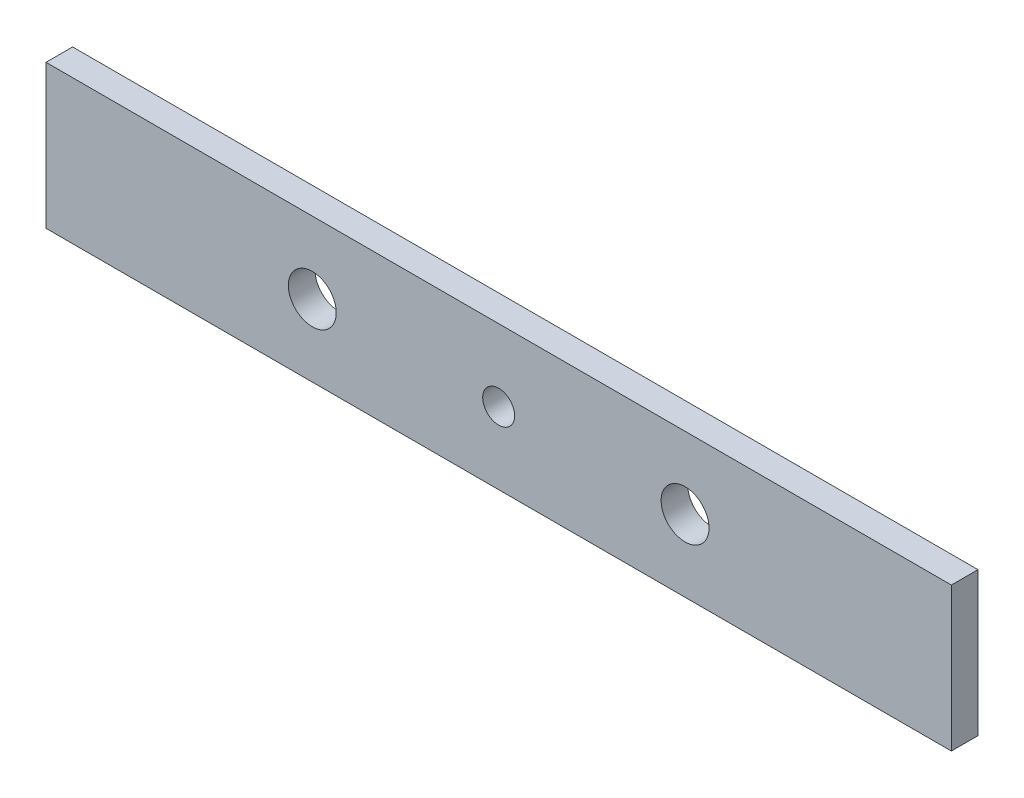
ISO-10303-21;
HEADER;
FILE_DESCRIPTION(('STEP AP214'),'2;1');
FILE_NAME('part.step','',(''),(''),'','','');
FILE_SCHEMA(('AUTOMOTIVE_DESIGN { 1 0 10303 214 1 1 1 1 }'));
ENDSEC;
DATA;
#1=APPLICATION_CONTEXT('core data for automotive mechanical design processes');
#2=APPLICATION_PROTOCOL_DEFINITION('international standard','automotive_design',2000,#1);
#3=PRODUCT_CONTEXT('',#1,'mechanical');
#4=PRODUCT('Part','Part','',(#3));
#5=PRODUCT_RELATED_PRODUCT_CATEGORY('part','',(#4));
#6=PRODUCT_DEFINITION_FORMATION('','',#4);
#7=PRODUCT_DEFINITION_CONTEXT('part definition',#1,'design');
#8=PRODUCT_DEFINITION('design','',#6,#7);
#9=PRODUCT_DEFINITION_SHAPE('','',#8);
#10=(LENGTH_UNIT() NAMED_UNIT(*) SI_UNIT(.MILLI.,.METRE.));
#11=(NAMED_UNIT(*) PLANE_ANGLE_UNIT() SI_UNIT($,.RADIAN.));
#12=(NAMED_UNIT(*) SI_UNIT($,.STERADIAN.) SOLID_ANGLE_UNIT());
#13=UNCERTAINTY_MEASURE_WITH_UNIT(LENGTH_MEASURE(1.E-05),#10,'distance_accuracy_value','');
#14=(GEOMETRIC_REPRESENTATION_CONTEXT(3) GLOBAL_UNCERTAINTY_ASSIGNED_CONTEXT((#13)) GLOBAL_UNIT_ASSIGNED_CONTEXT((#10,
#11,#12)) REPRESENTATION_CONTEXT('',''));
#15=CARTESIAN_POINT('',(0.,0.,0.));
#16=DIRECTION('',(0.,0.,1.));
#17=DIRECTION('',(1.,0.,0.));
#18=AXIS2_PLACEMENT_3D('',#15,#16,#17);
#19=CARTESIAN_POINT('',(0.,27.,0.));
#20=DIRECTION('',(1.,0.,0.));
#21=DIRECTION('',(0.,0.,-1.));
#22=AXIS2_PLACEMENT_3D('',#19,#20,#21);
#23=PLANE('',#22);
#24=DIRECTION('',(0.,0.,1.));
#25=VECTOR('',#24,1.);
#26=CARTESIAN_POINT('',(0.,0.,0.));
#27=LINE('',#26,#25);
#28=CARTESIAN_POINT('',(0.,0.,-5.));
#29=VERTEX_POINT('',#28);
#30=CARTESIAN_POINT('',(0.,0.,0.));
#31=VERTEX_POINT('',#30);
#32=EDGE_CURVE('E99',#29,#31,#27,.T.);
#33=ORIENTED_EDGE('',*,*,#32,.T.);
#34=DIRECTION('',(0.,-1.,0.));
#35=VECTOR('',#34,1.);
#36=CARTESIAN_POINT('',(0.,27.,0.));
#37=LINE('',#36,#35);
#38=CARTESIAN_POINT('',(0.,27.,0.));
#39=VERTEX_POINT('',#38);
#40=EDGE_CURVE('E11',#39,#31,#37,.T.);
#41=ORIENTED_EDGE('',*,*,#40,.F.);
#42=DIRECTION('',(0.,0.,1.));
#43=VECTOR('',#42,1.);
#44=CARTESIAN_POINT('',(0.,27.,0.));
#45=LINE('',#44,#43);
#46=CARTESIAN_POINT('',(0.,27.,-5.));
#47=VERTEX_POINT('',#46);
#48=EDGE_CURVE('E86',#47,#39,#45,.T.);
#49=ORIENTED_EDGE('',*,*,#48,.F.);
#50=DIRECTION('',(0.,-1.,0.));
#51=VECTOR('',#50,1.);
#52=CARTESIAN_POINT('',(0.,27.,-5.));
#53=LINE('',#52,#51);
#54=EDGE_CURVE('E95',#47,#29,#53,.T.);
#55=ORIENTED_EDGE('',*,*,#54,.T.);
#56=EDGE_LOOP('',(#33,#41,#49,#55));
#57=FACE_BOUND('',#56,.T.);
#58=ADVANCED_FACE('F33',(#57),#23,.F.);
#59=CARTESIAN_POINT('',(0.,27.,0.));
#60=DIRECTION('',(0.,0.,-1.));
#61=DIRECTION('',(-1.,0.,0.));
#62=AXIS2_PLACEMENT_3D('',#59,#60,#61);
#63=PLANE('',#62);
#64=CARTESIAN_POINT('',(120.,13.5,0.));
#65=DIRECTION('',(0.,0.,1.));
#66=DIRECTION('',(1.,0.,0.));
#67=AXIS2_PLACEMENT_3D('',#64,#65,#66);
#68=CIRCLE('',#67,4.49999999999999);
#69=CARTESIAN_POINT('',(124.5,13.5,0.));
#70=VERTEX_POINT('',#69);
#71=EDGE_CURVE('E210',#70,#70,#68,.T.);
#72=ORIENTED_EDGE('',*,*,#71,.F.);
#73=EDGE_LOOP('',(#72));
#74=FACE_BOUND('',#73,.T.);
#75=CARTESIAN_POINT('',(50.,13.5,0.));
#76=DIRECTION('',(0.,0.,1.));
#77=DIRECTION('',(1.,0.,0.));
#78=AXIS2_PLACEMENT_3D('',#75,#76,#77);
#79=CIRCLE('',#78,4.5);
#80=CARTESIAN_POINT('',(54.5,13.5,0.));
#81=VERTEX_POINT('',#80);
#82=EDGE_CURVE('E207',#81,#81,#79,.T.);
#83=ORIENTED_EDGE('',*,*,#82,.F.);
#84=EDGE_LOOP('',(#83));
#85=FACE_BOUND('',#84,.T.);
#86=CARTESIAN_POINT('',(85.,13.5,0.));
#87=DIRECTION('',(0.,0.,1.));
#88=DIRECTION('',(1.,0.,0.));
#89=AXIS2_PLACEMENT_3D('',#86,#87,#88);
#90=CIRCLE('',#89,3.00000000000001);
#91=CARTESIAN_POINT('',(88.,13.5,0.));
#92=VERTEX_POINT('',#91);
#93=EDGE_CURVE('E110',#92,#92,#90,.T.);
#94=ORIENTED_EDGE('',*,*,#93,.F.);
#95=EDGE_LOOP('',(#94));
#96=FACE_BOUND('',#95,.T.);
#97=DIRECTION('',(1.,0.,0.));
#98=VECTOR('',#97,1.);
#99=CARTESIAN_POINT('',(0.,0.,0.));
#100=LINE('',#99,#98);
#101=CARTESIAN_POINT('',(170.,0.,0.));
#102=VERTEX_POINT('',#101);
#103=EDGE_CURVE('E90',#31,#102,#100,.T.);
#104=ORIENTED_EDGE('',*,*,#103,.T.);
#105=DIRECTION('',(0.,-1.,0.));
#106=VECTOR('',#105,1.);
#107=CARTESIAN_POINT('',(170.,27.,0.));
#108=LINE('',#107,#106);
#109=CARTESIAN_POINT('',(170.,27.,0.));
#110=VERTEX_POINT('',#109);
#111=EDGE_CURVE('E42',#110,#102,#108,.T.);
#112=ORIENTED_EDGE('',*,*,#111,.F.);
#113=DIRECTION('',(1.,0.,0.));
#114=VECTOR('',#113,1.);
#115=CARTESIAN_POINT('',(0.,27.,0.));
#116=LINE('',#115,#114);
#117=EDGE_CURVE('E81',#39,#110,#116,.T.);
#118=ORIENTED_EDGE('',*,*,#117,.F.);
#119=ORIENTED_EDGE('',*,*,#40,.T.);
#120=EDGE_LOOP('',(#104,#112,#118,#119));
#121=FACE_BOUND('',#120,.T.);
#122=ADVANCED_FACE('F89',(#74,#85,#96,#121),#63,.F.);
#123=CARTESIAN_POINT('',(170.,27.,0.));
#124=DIRECTION('',(-1.,0.,0.));
#125=DIRECTION('',(0.,0.,1.));
#126=AXIS2_PLACEMENT_3D('',#123,#124,#125);
#127=PLANE('',#126);
#128=DIRECTION('',(0.,0.,-1.));
#129=VECTOR('',#128,1.);
#130=CARTESIAN_POINT('',(170.,0.,0.));
#131=LINE('',#130,#129);
#132=CARTESIAN_POINT('',(170.,0.,-5.));
#133=VERTEX_POINT('',#132);
#134=EDGE_CURVE('E68',#102,#133,#131,.T.);
#135=ORIENTED_EDGE('',*,*,#134,.T.);
#136=DIRECTION('',(0.,-1.,0.));
#137=VECTOR('',#136,1.);
#138=CARTESIAN_POINT('',(170.,27.,-5.));
#139=LINE('',#138,#137);
#140=CARTESIAN_POINT('',(170.,27.,-5.));
#141=VERTEX_POINT('',#140);
#142=EDGE_CURVE('E91',#141,#133,#139,.T.);
#143=ORIENTED_EDGE('',*,*,#142,.F.);
#144=DIRECTION('',(0.,0.,-1.));
#145=VECTOR('',#144,1.);
#146=CARTESIAN_POINT('',(170.,27.,0.));
#147=LINE('',#146,#145);
#148=EDGE_CURVE('E84',#110,#141,#147,.T.);
#149=ORIENTED_EDGE('',*,*,#148,.F.);
#150=ORIENTED_EDGE('',*,*,#111,.T.);
#151=EDGE_LOOP('',(#135,#143,#149,#150));
#152=FACE_BOUND('',#151,.T.);
#153=ADVANCED_FACE('F93',(#152),#127,.F.);
#154=CARTESIAN_POINT('',(0.,27.,-5.));
#155=DIRECTION('',(0.,0.,1.));
#156=DIRECTION('',(1.,0.,0.));
#157=AXIS2_PLACEMENT_3D('',#154,#155,#156);
#158=PLANE('',#157);
#159=CARTESIAN_POINT('',(120.,13.5,-5.));
#160=DIRECTION('',(0.,0.,1.));
#161=DIRECTION('',(1.,0.,0.));
#162=AXIS2_PLACEMENT_3D('',#159,#160,#161);
#163=CIRCLE('',#162,4.49999999999999);
#164=CARTESIAN_POINT('',(124.5,13.5,-5.));
#165=VERTEX_POINT('',#164);
#166=EDGE_CURVE('E36',#165,#165,#163,.T.);
#167=ORIENTED_EDGE('',*,*,#166,.T.);
#168=EDGE_LOOP('',(#167));
#169=FACE_BOUND('',#168,.T.);
#170=CARTESIAN_POINT('',(50.,13.5,-5.));
#171=DIRECTION('',(0.,0.,1.));
#172=DIRECTION('',(1.,0.,0.));
#173=AXIS2_PLACEMENT_3D('',#170,#171,#172);
#174=CIRCLE('',#173,4.5);
#175=CARTESIAN_POINT('',(54.5,13.5,-5.));
#176=VERTEX_POINT('',#175);
#177=EDGE_CURVE('E109',#176,#176,#174,.T.);
#178=ORIENTED_EDGE('',*,*,#177,.T.);
#179=EDGE_LOOP('',(#178));
#180=FACE_BOUND('',#179,.T.);
#181=CARTESIAN_POINT('',(85.,13.5,-5.));
#182=DIRECTION('',(0.,0.,1.));
#183=DIRECTION('',(1.,0.,0.));
#184=AXIS2_PLACEMENT_3D('',#181,#182,#183);
#185=CIRCLE('',#184,3.00000000000001);
#186=CARTESIAN_POINT('',(88.,13.5,-5.));
#187=VERTEX_POINT('',#186);
#188=EDGE_CURVE('E107',#187,#187,#185,.T.);
#189=ORIENTED_EDGE('',*,*,#188,.T.);
#190=EDGE_LOOP('',(#189));
#191=FACE_BOUND('',#190,.T.);
#192=DIRECTION('',(-1.,0.,0.));
#193=VECTOR('',#192,1.);
#194=CARTESIAN_POINT('',(0.,0.,-5.));
#195=LINE('',#194,#193);
#196=EDGE_CURVE('E74',#133,#29,#195,.T.);
#197=ORIENTED_EDGE('',*,*,#196,.T.);
#198=ORIENTED_EDGE('',*,*,#54,.F.);
#199=DIRECTION('',(-1.,0.,0.));
#200=VECTOR('',#199,1.);
#201=CARTESIAN_POINT('',(0.,27.,-5.));
#202=LINE('',#201,#200);
#203=EDGE_CURVE('E51',#141,#47,#202,.T.);
#204=ORIENTED_EDGE('',*,*,#203,.F.);
#205=ORIENTED_EDGE('',*,*,#142,.T.);
#206=EDGE_LOOP('',(#197,#198,#204,#205));
#207=FACE_BOUND('',#206,.T.);
#208=ADVANCED_FACE('F117',(#169,#180,#191,#207),#158,.F.);
#209=CARTESIAN_POINT('',(0.,27.,0.));
#210=DIRECTION('',(0.,-1.,0.));
#211=DIRECTION('',(0.,0.,-1.));
#212=AXIS2_PLACEMENT_3D('',#209,#210,#211);
#213=PLANE('',#212);
#214=ORIENTED_EDGE('',*,*,#48,.T.);
#215=ORIENTED_EDGE('',*,*,#117,.T.);
#216=ORIENTED_EDGE('',*,*,#148,.T.);
#217=ORIENTED_EDGE('',*,*,#203,.T.);
#218=EDGE_LOOP('',(#214,#215,#216,#217));
#219=FACE_BOUND('',#218,.T.);
#220=ADVANCED_FACE('F82',(#219),#213,.F.);
#221=CARTESIAN_POINT('',(0.,0.,0.));
#222=DIRECTION('',(0.,-1.,0.));
#223=DIRECTION('',(0.,0.,-1.));
#224=AXIS2_PLACEMENT_3D('',#221,#222,#223);
#225=PLANE('',#224);
#226=ORIENTED_EDGE('',*,*,#32,.F.);
#227=ORIENTED_EDGE('',*,*,#196,.F.);
#228=ORIENTED_EDGE('',*,*,#134,.F.);
#229=ORIENTED_EDGE('',*,*,#103,.F.);
#230=EDGE_LOOP('',(#226,#227,#228,#229));
#231=FACE_BOUND('',#230,.T.);
#232=ADVANCED_FACE('F140',(#231),#225,.T.);
#233=CARTESIAN_POINT('',(85.,13.5,-29.));
#234=DIRECTION('',(0.,0.,1.));
#235=DIRECTION('',(1.,0.,0.));
#236=AXIS2_PLACEMENT_3D('',#233,#234,#235);
#237=CYLINDRICAL_SURFACE('',#236,3.00000000000001);
#238=CARTESIAN_POINT('',(88.,13.5,0.));
#239=CARTESIAN_POINT('',(88.,13.5,-0.0520833333333334));
#240=CARTESIAN_POINT('',(88.,13.5,-0.104166666666667));
#241=CARTESIAN_POINT('',(88.,13.5,-0.208333333333334));
#242=CARTESIAN_POINT('',(88.,13.5,-0.260416666666667));
#243=CARTESIAN_POINT('',(88.,13.5,-0.364583333333334));
#244=CARTESIAN_POINT('',(88.,13.5,-0.416666666666667));
#245=CARTESIAN_POINT('',(88.,13.5,-0.520833333333334));
#246=CARTESIAN_POINT('',(88.,13.5,-0.572916666666667));
#247=CARTESIAN_POINT('',(88.,13.5,-0.677083333333334));
#248=CARTESIAN_POINT('',(88.,13.5,-0.729166666666667));
#249=CARTESIAN_POINT('',(88.,13.5,-0.833333333333334));
#250=CARTESIAN_POINT('',(88.,13.5,-0.885416666666668));
#251=CARTESIAN_POINT('',(88.,13.5,-0.989583333333334));
#252=CARTESIAN_POINT('',(88.,13.5,-1.04166666666667));
#253=CARTESIAN_POINT('',(88.,13.5,-1.14583333333333));
#254=CARTESIAN_POINT('',(88.,13.5,-1.19791666666667));
#255=CARTESIAN_POINT('',(88.,13.5,-1.30208333333333));
#256=CARTESIAN_POINT('',(88.,13.5,-1.35416666666667));
#257=CARTESIAN_POINT('',(88.,13.5,-1.45833333333333));
#258=CARTESIAN_POINT('',(88.,13.5,-1.51041666666667));
#259=CARTESIAN_POINT('',(88.,13.5,-1.61458333333333));
#260=CARTESIAN_POINT('',(88.,13.5,-1.66666666666667));
#261=CARTESIAN_POINT('',(88.,13.5,-1.77083333333334));
#262=CARTESIAN_POINT('',(88.,13.5,-1.82291666666667));
#263=CARTESIAN_POINT('',(88.,13.5,-1.92708333333334));
#264=CARTESIAN_POINT('',(88.,13.5,-1.97916666666667));
#265=CARTESIAN_POINT('',(88.,13.5,-2.08333333333334));
#266=CARTESIAN_POINT('',(88.,13.5,-2.13541666666667));
#267=CARTESIAN_POINT('',(88.,13.5,-2.23958333333334));
#268=CARTESIAN_POINT('',(88.,13.5,-2.29166666666667));
#269=CARTESIAN_POINT('',(88.,13.5,-2.39583333333334));
#270=CARTESIAN_POINT('',(88.,13.5,-2.44791666666667));
#271=CARTESIAN_POINT('',(88.,13.5,-2.55208333333334));
#272=CARTESIAN_POINT('',(88.,13.5,-2.60416666666667));
#273=CARTESIAN_POINT('',(88.,13.5,-2.70833333333334));
#274=CARTESIAN_POINT('',(88.,13.5,-2.76041666666667));
#275=CARTESIAN_POINT('',(88.,13.5,-2.86458333333334));
#276=CARTESIAN_POINT('',(88.,13.5,-2.91666666666667));
#277=CARTESIAN_POINT('',(88.,13.5,-3.02083333333334));
#278=CARTESIAN_POINT('',(88.,13.5,-3.07291666666667));
#279=CARTESIAN_POINT('',(88.,13.5,-3.17708333333334));
#280=CARTESIAN_POINT('',(88.,13.5,-3.22916666666667));
#281=CARTESIAN_POINT('',(88.,13.5,-3.33333333333334));
#282=CARTESIAN_POINT('',(88.,13.5,-3.38541666666667));
#283=CARTESIAN_POINT('',(88.,13.5,-3.48958333333334));
#284=CARTESIAN_POINT('',(88.,13.5,-3.54166666666667));
#285=CARTESIAN_POINT('',(88.,13.5,-3.64583333333334));
#286=CARTESIAN_POINT('',(88.,13.5,-3.69791666666667));
#287=CARTESIAN_POINT('',(88.,13.5,-3.80208333333334));
#288=CARTESIAN_POINT('',(88.,13.5,-3.85416666666667));
#289=CARTESIAN_POINT('',(88.,13.5,-3.95833333333334));
#290=CARTESIAN_POINT('',(88.,13.5,-4.01041666666667));
#291=CARTESIAN_POINT('',(88.,13.5,-4.11458333333334));
#292=CARTESIAN_POINT('',(88.,13.5,-4.16666666666667));
#293=CARTESIAN_POINT('',(88.,13.5,-4.27083333333334));
#294=CARTESIAN_POINT('',(88.,13.5,-4.32291666666667));
#295=CARTESIAN_POINT('',(88.,13.5,-4.42708333333334));
#296=CARTESIAN_POINT('',(88.,13.5,-4.47916666666667));
#297=CARTESIAN_POINT('',(88.,13.5,-4.58333333333334));
#298=CARTESIAN_POINT('',(88.,13.5,-4.63541666666667));
#299=CARTESIAN_POINT('',(88.,13.5,-4.73958333333334));
#300=CARTESIAN_POINT('',(88.,13.5,-4.79166666666667));
#301=CARTESIAN_POINT('',(88.,13.5,-4.89583333333334));
#302=CARTESIAN_POINT('',(88.,13.5,-4.94791666666667));
#303=CARTESIAN_POINT('',(88.,13.5,-5.));
#304=B_SPLINE_CURVE_WITH_KNOTS('',3,(#238,#239,#240,#241,#242,#243,#244,#245,#246,#247,#248,
#249,#250,#251,#252,#253,#254,#255,#256,#257,#258,#259,#260,#261,#262,#263,#264,#265,#266,#267,
#268,#269,#270,#271,#272,#273,#274,#275,#276,#277,#278,#279,#280,#281,#282,#283,#284,#285,#286,
#287,#288,#289,#290,#291,#292,#293,#294,#295,#296,#297,#298,#299,#300,#301,#302,#303),
.UNSPECIFIED.,.F.,.F.,(4,2,2,2,2,2,2,2,2,2,2,2,2,2,2,2,2,2,2,2,2,2,2,2,2,2,2,2,2,2,2,2,4),(0.,
0.15625,0.3125,0.46875,0.625000000000001,0.781250000000001,0.937500000000001,1.09375,1.25,
1.40625,1.5625,1.71875,1.875,2.03125,2.1875,2.34375,2.5,2.65625,2.8125,2.96875,3.125,3.28125,
3.4375,3.59375,3.75,3.90625,4.0625,4.21875,4.375,4.53125,4.6875,4.84375,5.),.UNSPECIFIED.);
#305=EDGE_CURVE('BSEAM127',#92,#187,#304,.T.);
#306=ORIENTED_EDGE('',*,*,#93,.T.);
#307=ORIENTED_EDGE('',*,*,#188,.F.);
#308=ORIENTED_EDGE('',*,*,#305,.T.);
#309=ORIENTED_EDGE('',*,*,#305,.F.);
#310=EDGE_LOOP('',(#306,#308,#307,#309));
#311=FACE_BOUND('',#310,.T.);
#312=ADVANCED_FACE('F127',(#311),#237,.F.);
#313=CARTESIAN_POINT('',(50.,13.5,-29.));
#314=DIRECTION('',(0.,0.,1.));
#315=DIRECTION('',(1.,0.,0.));
#316=AXIS2_PLACEMENT_3D('',#313,#314,#315);
#317=CYLINDRICAL_SURFACE('',#316,4.5);
#318=CARTESIAN_POINT('',(54.5,13.5,0.));
#319=CARTESIAN_POINT('',(54.5,13.5,-0.0520833333333334));
#320=CARTESIAN_POINT('',(54.5,13.5,-0.104166666666667));
#321=CARTESIAN_POINT('',(54.5,13.5,-0.208333333333334));
#322=CARTESIAN_POINT('',(54.5,13.5,-0.260416666666667));
#323=CARTESIAN_POINT('',(54.5,13.5,-0.364583333333334));
#324=CARTESIAN_POINT('',(54.5,13.5,-0.416666666666667));
#325=CARTESIAN_POINT('',(54.5,13.5,-0.520833333333334));
#326=CARTESIAN_POINT('',(54.5,13.5,-0.572916666666667));
#327=CARTESIAN_POINT('',(54.5,13.5,-0.677083333333334));
#328=CARTESIAN_POINT('',(54.5,13.5,-0.729166666666667));
#329=CARTESIAN_POINT('',(54.5,13.5,-0.833333333333334));
#330=CARTESIAN_POINT('',(54.5,13.5,-0.885416666666668));
#331=CARTESIAN_POINT('',(54.5,13.5,-0.989583333333334));
#332=CARTESIAN_POINT('',(54.5,13.5,-1.04166666666667));
#333=CARTESIAN_POINT('',(54.5,13.5,-1.14583333333333));
#334=CARTESIAN_POINT('',(54.5,13.5,-1.19791666666667));
#335=CARTESIAN_POINT('',(54.5,13.5,-1.30208333333333));
#336=CARTESIAN_POINT('',(54.5,13.5,-1.35416666666667));
#337=CARTESIAN_POINT('',(54.5,13.5,-1.45833333333333));
#338=CARTESIAN_POINT('',(54.5,13.5,-1.51041666666667));
#339=CARTESIAN_POINT('',(54.5,13.5,-1.61458333333333));
#340=CARTESIAN_POINT('',(54.5,13.5,-1.66666666666667));
#341=CARTESIAN_POINT('',(54.5,13.5,-1.77083333333334));
#342=CARTESIAN_POINT('',(54.5,13.5,-1.82291666666667));
#343=CARTESIAN_POINT('',(54.5,13.5,-1.92708333333334));
#344=CARTESIAN_POINT('',(54.5,13.5,-1.97916666666667));
#345=CARTESIAN_POINT('',(54.5,13.5,-2.08333333333334));
#346=CARTESIAN_POINT('',(54.5,13.5,-2.13541666666667));
#347=CARTESIAN_POINT('',(54.5,13.5,-2.23958333333334));
#348=CARTESIAN_POINT('',(54.5,13.5,-2.29166666666667));
#349=CARTESIAN_POINT('',(54.5,13.5,-2.39583333333334));
#350=CARTESIAN_POINT('',(54.5,13.5,-2.44791666666667));
#351=CARTESIAN_POINT('',(54.5,13.5,-2.55208333333334));
#352=CARTESIAN_POINT('',(54.5,13.5,-2.60416666666667));
#353=CARTESIAN_POINT('',(54.5,13.5,-2.70833333333334));
#354=CARTESIAN_POINT('',(54.5,13.5,-2.76041666666667));
#355=CARTESIAN_POINT('',(54.5,13.5,-2.86458333333334));
#356=CARTESIAN_POINT('',(54.5,13.5,-2.91666666666667));
#357=CARTESIAN_POINT('',(54.5,13.5,-3.02083333333334));
#358=CARTESIAN_POINT('',(54.5,13.5,-3.07291666666667));
#359=CARTESIAN_POINT('',(54.5,13.5,-3.17708333333334));
#360=CARTESIAN_POINT('',(54.5,13.5,-3.22916666666667));
#361=CARTESIAN_POINT('',(54.5,13.5,-3.33333333333334));
#362=CARTESIAN_POINT('',(54.5,13.5,-3.38541666666667));
#363=CARTESIAN_POINT('',(54.5,13.5,-3.48958333333334));
#364=CARTESIAN_POINT('',(54.5,13.5,-3.54166666666667));
#365=CARTESIAN_POINT('',(54.5,13.5,-3.64583333333334));
#366=CARTESIAN_POINT('',(54.5,13.5,-3.69791666666667));
#367=CARTESIAN_POINT('',(54.5,13.5,-3.80208333333334));
#368=CARTESIAN_POINT('',(54.5,13.5,-3.85416666666667));
#369=CARTESIAN_POINT('',(54.5,13.5,-3.95833333333334));
#370=CARTESIAN_POINT('',(54.5,13.5,-4.01041666666667));
#371=CARTESIAN_POINT('',(54.5,13.5,-4.11458333333334));
#372=CARTESIAN_POINT('',(54.5,13.5,-4.16666666666667));
#373=CARTESIAN_POINT('',(54.5,13.5,-4.27083333333334));
#374=CARTESIAN_POINT('',(54.5,13.5,-4.32291666666667));
#375=CARTESIAN_POINT('',(54.5,13.5,-4.42708333333334));
#376=CARTESIAN_POINT('',(54.5,13.5,-4.47916666666667));
#377=CARTESIAN_POINT('',(54.5,13.5,-4.58333333333334));
#378=CARTESIAN_POINT('',(54.5,13.5,-4.63541666666667));
#379=CARTESIAN_POINT('',(54.5,13.5,-4.73958333333334));
#380=CARTESIAN_POINT('',(54.5,13.5,-4.79166666666667));
#381=CARTESIAN_POINT('',(54.5,13.5,-4.89583333333334));
#382=CARTESIAN_POINT('',(54.5,13.5,-4.94791666666667));
#383=CARTESIAN_POINT('',(54.5,13.5,-5.));
#384=B_SPLINE_CURVE_WITH_KNOTS('',3,(#318,#319,#320,#321,#322,#323,#324,#325,#326,#327,#328,
#329,#330,#331,#332,#333,#334,#335,#336,#337,#338,#339,#340,#341,#342,#343,#344,#345,#346,#347,
#348,#349,#350,#351,#352,#353,#354,#355,#356,#357,#358,#359,#360,#361,#362,#363,#364,#365,#366,
#367,#368,#369,#370,#371,#372,#373,#374,#375,#376,#377,#378,#379,#380,#381,#382,#383),
.UNSPECIFIED.,.F.,.F.,(4,2,2,2,2,2,2,2,2,2,2,2,2,2,2,2,2,2,2,2,2,2,2,2,2,2,2,2,2,2,2,2,4),(0.,
0.15625,0.3125,0.46875,0.625000000000001,0.781250000000001,0.937500000000001,1.09375,1.25,
1.40625,1.5625,1.71875,1.875,2.03125,2.1875,2.34375,2.5,2.65625,2.8125,2.96875,3.125,3.28125,
3.4375,3.59375,3.75,3.90625,4.0625,4.21875,4.375,4.53125,4.6875,4.84375,5.),.UNSPECIFIED.);
#385=EDGE_CURVE('BSEAM121',#81,#176,#384,.T.);
#386=ORIENTED_EDGE('',*,*,#82,.T.);
#387=ORIENTED_EDGE('',*,*,#177,.F.);
#388=ORIENTED_EDGE('',*,*,#385,.T.);
#389=ORIENTED_EDGE('',*,*,#385,.F.);
#390=EDGE_LOOP('',(#386,#388,#387,#389));
#391=FACE_BOUND('',#390,.T.);
#392=ADVANCED_FACE('F121',(#391),#317,.F.);
#393=CARTESIAN_POINT('',(120.,13.5,-29.));
#394=DIRECTION('',(0.,0.,1.));
#395=DIRECTION('',(1.,0.,0.));
#396=AXIS2_PLACEMENT_3D('',#393,#394,#395);
#397=CYLINDRICAL_SURFACE('',#396,4.49999999999999);
#398=CARTESIAN_POINT('',(124.5,13.5,0.));
#399=CARTESIAN_POINT('',(124.5,13.5,-0.0520833333333334));
#400=CARTESIAN_POINT('',(124.5,13.5,-0.104166666666667));
#401=CARTESIAN_POINT('',(124.5,13.5,-0.208333333333334));
#402=CARTESIAN_POINT('',(124.5,13.5,-0.260416666666667));
#403=CARTESIAN_POINT('',(124.5,13.5,-0.364583333333334));
#404=CARTESIAN_POINT('',(124.5,13.5,-0.416666666666667));
#405=CARTESIAN_POINT('',(124.5,13.5,-0.520833333333334));
#406=CARTESIAN_POINT('',(124.5,13.5,-0.572916666666667));
#407=CARTESIAN_POINT('',(124.5,13.5,-0.677083333333334));
#408=CARTESIAN_POINT('',(124.5,13.5,-0.729166666666667));
#409=CARTESIAN_POINT('',(124.5,13.5,-0.833333333333334));
#410=CARTESIAN_POINT('',(124.5,13.5,-0.885416666666668));
#411=CARTESIAN_POINT('',(124.5,13.5,-0.989583333333334));
#412=CARTESIAN_POINT('',(124.5,13.5,-1.04166666666667));
#413=CARTESIAN_POINT('',(124.5,13.5,-1.14583333333333));
#414=CARTESIAN_POINT('',(124.5,13.5,-1.19791666666667));
#415=CARTESIAN_POINT('',(124.5,13.5,-1.30208333333333));
#416=CARTESIAN_POINT('',(124.5,13.5,-1.35416666666667));
#417=CARTESIAN_POINT('',(124.5,13.5,-1.45833333333333));
#418=CARTESIAN_POINT('',(124.5,13.5,-1.51041666666667));
#419=CARTESIAN_POINT('',(124.5,13.5,-1.61458333333333));
#420=CARTESIAN_POINT('',(124.5,13.5,-1.66666666666667));
#421=CARTESIAN_POINT('',(124.5,13.5,-1.77083333333334));
#422=CARTESIAN_POINT('',(124.5,13.5,-1.82291666666667));
#423=CARTESIAN_POINT('',(124.5,13.5,-1.92708333333334));
#424=CARTESIAN_POINT('',(124.5,13.5,-1.97916666666667));
#425=CARTESIAN_POINT('',(124.5,13.5,-2.08333333333334));
#426=CARTESIAN_POINT('',(124.5,13.5,-2.13541666666667));
#427=CARTESIAN_POINT('',(124.5,13.5,-2.23958333333334));
#428=CARTESIAN_POINT('',(124.5,13.5,-2.29166666666667));
#429=CARTESIAN_POINT('',(124.5,13.5,-2.39583333333334));
#430=CARTESIAN_POINT('',(124.5,13.5,-2.44791666666667));
#431=CARTESIAN_POINT('',(124.5,13.5,-2.55208333333334));
#432=CARTESIAN_POINT('',(124.5,13.5,-2.60416666666667));
#433=CARTESIAN_POINT('',(124.5,13.5,-2.70833333333334));
#434=CARTESIAN_POINT('',(124.5,13.5,-2.76041666666667));
#435=CARTESIAN_POINT('',(124.5,13.5,-2.86458333333334));
#436=CARTESIAN_POINT('',(124.5,13.5,-2.91666666666667));
#437=CARTESIAN_POINT('',(124.5,13.5,-3.02083333333334));
#438=CARTESIAN_POINT('',(124.5,13.5,-3.07291666666667));
#439=CARTESIAN_POINT('',(124.5,13.5,-3.17708333333334));
#440=CARTESIAN_POINT('',(124.5,13.5,-3.22916666666667));
#441=CARTESIAN_POINT('',(124.5,13.5,-3.33333333333334));
#442=CARTESIAN_POINT('',(124.5,13.5,-3.38541666666667));
#443=CARTESIAN_POINT('',(124.5,13.5,-3.48958333333334));
#444=CARTESIAN_POINT('',(124.5,13.5,-3.54166666666667));
#445=CARTESIAN_POINT('',(124.5,13.5,-3.64583333333334));
#446=CARTESIAN_POINT('',(124.5,13.5,-3.69791666666667));
#447=CARTESIAN_POINT('',(124.5,13.5,-3.80208333333334));
#448=CARTESIAN_POINT('',(124.5,13.5,-3.85416666666667));
#449=CARTESIAN_POINT('',(124.5,13.5,-3.95833333333334));
#450=CARTESIAN_POINT('',(124.5,13.5,-4.01041666666667));
#451=CARTESIAN_POINT('',(124.5,13.5,-4.11458333333334));
#452=CARTESIAN_POINT('',(124.5,13.5,-4.16666666666667));
#453=CARTESIAN_POINT('',(124.5,13.5,-4.27083333333334));
#454=CARTESIAN_POINT('',(124.5,13.5,-4.32291666666667));
#455=CARTESIAN_POINT('',(124.5,13.5,-4.42708333333334));
#456=CARTESIAN_POINT('',(124.5,13.5,-4.47916666666667));
#457=CARTESIAN_POINT('',(124.5,13.5,-4.58333333333334));
#458=CARTESIAN_POINT('',(124.5,13.5,-4.63541666666667));
#459=CARTESIAN_POINT('',(124.5,13.5,-4.73958333333334));
#460=CARTESIAN_POINT('',(124.5,13.5,-4.79166666666667));
#461=CARTESIAN_POINT('',(124.5,13.5,-4.89583333333334));
#462=CARTESIAN_POINT('',(124.5,13.5,-4.94791666666667));
#463=CARTESIAN_POINT('',(124.5,13.5,-5.));
#464=B_SPLINE_CURVE_WITH_KNOTS('',3,(#398,#399,#400,#401,#402,#403,#404,#405,#406,#407,#408,
#409,#410,#411,#412,#413,#414,#415,#416,#417,#418,#419,#420,#421,#422,#423,#424,#425,#426,#427,
#428,#429,#430,#431,#432,#433,#434,#435,#436,#437,#438,#439,#440,#441,#442,#443,#444,#445,#446,
#447,#448,#449,#450,#451,#452,#453,#454,#455,#456,#457,#458,#459,#460,#461,#462,#463),
.UNSPECIFIED.,.F.,.F.,(4,2,2,2,2,2,2,2,2,2,2,2,2,2,2,2,2,2,2,2,2,2,2,2,2,2,2,2,2,2,2,2,4),(0.,
0.15625,0.3125,0.46875,0.625000000000001,0.781250000000001,0.937500000000001,1.09375,1.25,
1.40625,1.5625,1.71875,1.875,2.03125,2.1875,2.34375,2.5,2.65625,2.8125,2.96875,3.125,3.28125,
3.4375,3.59375,3.75,3.90625,4.0625,4.21875,4.375,4.53125,4.6875,4.84375,5.),.UNSPECIFIED.);
#465=EDGE_CURVE('BSEAM119',#70,#165,#464,.T.);
#466=ORIENTED_EDGE('',*,*,#71,.T.);
#467=ORIENTED_EDGE('',*,*,#166,.F.);
#468=ORIENTED_EDGE('',*,*,#465,.T.);
#469=ORIENTED_EDGE('',*,*,#465,.F.);
#470=EDGE_LOOP('',(#466,#468,#467,#469));
#471=FACE_BOUND('',#470,.T.);
#472=ADVANCED_FACE('F119',(#471),#397,.F.);
#473=CLOSED_SHELL('',(#58,#122,#153,#208,#220,#232,#312,#392,#472));
#474=MANIFOLD_SOLID_BREP('B2',#473);
#475=ADVANCED_BREP_SHAPE_REPRESENTATION('',(#18,#474),#14);
#476=SHAPE_DEFINITION_REPRESENTATION(#9,#475);
ENDSEC;
END-ISO-10303-21;
